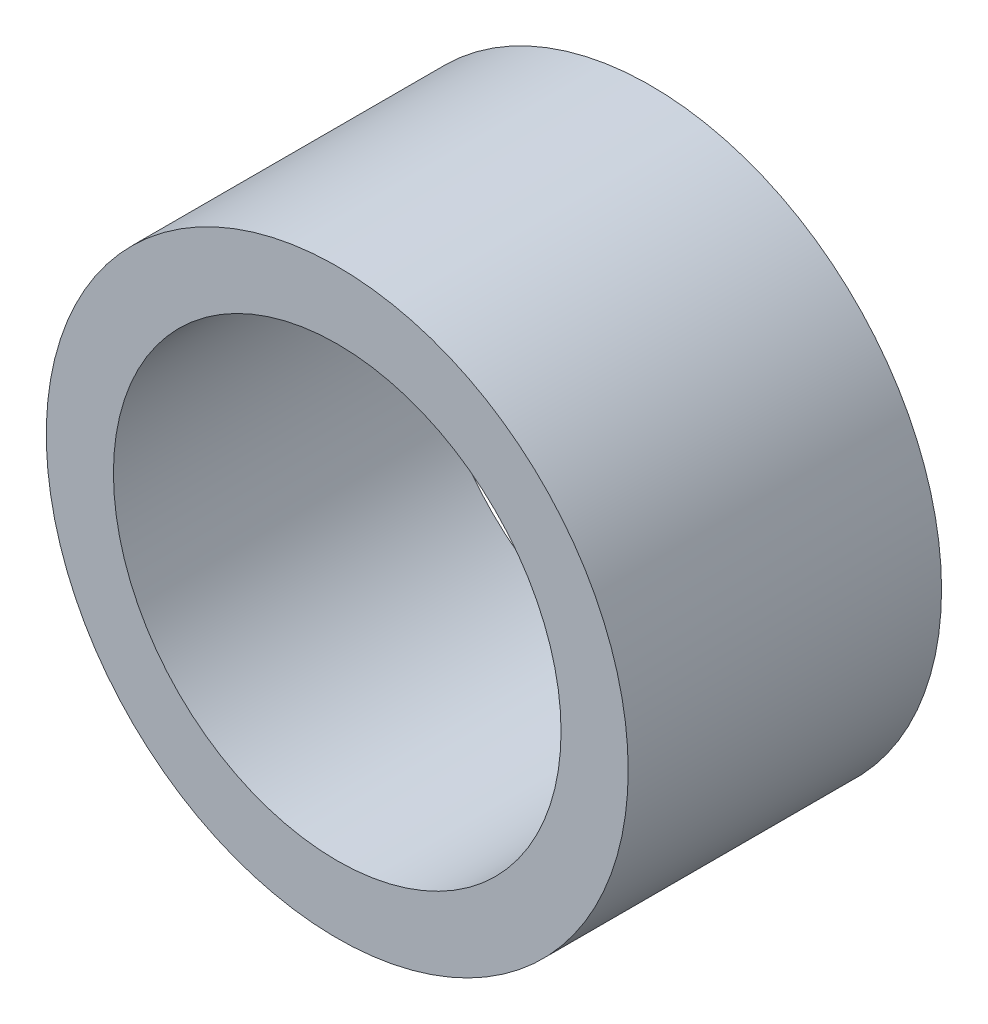
ISO-10303-21;
HEADER;
FILE_DESCRIPTION(('STEP AP214'),'2;1');
FILE_NAME('part.step','',(''),(''),'','','');
FILE_SCHEMA(('AUTOMOTIVE_DESIGN { 1 0 10303 214 1 1 1 1 }'));
ENDSEC;
DATA;
#1=APPLICATION_CONTEXT('core data for automotive mechanical design processes');
#2=APPLICATION_PROTOCOL_DEFINITION('international standard','automotive_design',2000,#1);
#3=PRODUCT_CONTEXT('',#1,'mechanical');
#4=PRODUCT('Part','Part','',(#3));
#5=PRODUCT_RELATED_PRODUCT_CATEGORY('part','',(#4));
#6=PRODUCT_DEFINITION_FORMATION('','',#4);
#7=PRODUCT_DEFINITION_CONTEXT('part definition',#1,'design');
#8=PRODUCT_DEFINITION('design','',#6,#7);
#9=PRODUCT_DEFINITION_SHAPE('','',#8);
#10=(LENGTH_UNIT() NAMED_UNIT(*) SI_UNIT(.MILLI.,.METRE.));
#11=(NAMED_UNIT(*) PLANE_ANGLE_UNIT() SI_UNIT($,.RADIAN.));
#12=(NAMED_UNIT(*) SI_UNIT($,.STERADIAN.) SOLID_ANGLE_UNIT());
#13=UNCERTAINTY_MEASURE_WITH_UNIT(LENGTH_MEASURE(1.E-05),#10,'distance_accuracy_value','');
#14=(GEOMETRIC_REPRESENTATION_CONTEXT(3) GLOBAL_UNCERTAINTY_ASSIGNED_CONTEXT((#13)) GLOBAL_UNIT_ASSIGNED_CONTEXT((#10,
#11,#12)) REPRESENTATION_CONTEXT('',''));
#15=CARTESIAN_POINT('',(0.,0.,0.));
#16=DIRECTION('',(0.,0.,1.));
#17=DIRECTION('',(1.,0.,0.));
#18=AXIS2_PLACEMENT_3D('',#15,#16,#17);
#19=CARTESIAN_POINT('',(0.,0.,7.));
#20=DIRECTION('',(0.,0.,1.));
#21=DIRECTION('',(1.,0.,0.));
#22=AXIS2_PLACEMENT_3D('',#19,#20,#21);
#23=PLANE('',#22);
#24=CARTESIAN_POINT('',(0.,0.,7.));
#25=DIRECTION('',(0.,0.,1.));
#26=DIRECTION('',(1.,0.,0.));
#27=AXIS2_PLACEMENT_3D('',#24,#25,#26);
#28=CIRCLE('',#27,6.5);
#29=CARTESIAN_POINT('',(6.5,0.,7.));
#30=VERTEX_POINT('',#29);
#31=EDGE_CURVE('E10',#30,#30,#28,.T.);
#32=ORIENTED_EDGE('',*,*,#31,.T.);
#33=EDGE_LOOP('',(#32));
#34=FACE_BOUND('',#33,.T.);
#35=CARTESIAN_POINT('',(0.,0.,7.));
#36=DIRECTION('',(0.,0.,1.));
#37=DIRECTION('',(1.,0.,0.));
#38=AXIS2_PLACEMENT_3D('',#35,#36,#37);
#39=CIRCLE('',#38,5.);
#40=CARTESIAN_POINT('',(5.,0.,7.));
#41=VERTEX_POINT('',#40);
#42=EDGE_CURVE('E50',#41,#41,#39,.T.);
#43=ORIENTED_EDGE('',*,*,#42,.F.);
#44=EDGE_LOOP('',(#43));
#45=FACE_BOUND('',#44,.T.);
#46=ADVANCED_FACE('F37',(#34,#45),#23,.T.);
#47=CARTESIAN_POINT('',(0.,0.,0.));
#48=DIRECTION('',(0.,0.,1.));
#49=DIRECTION('',(1.,0.,0.));
#50=AXIS2_PLACEMENT_3D('',#47,#48,#49);
#51=PLANE('',#50);
#52=CARTESIAN_POINT('',(0.,0.,0.));
#53=DIRECTION('',(0.,0.,1.));
#54=DIRECTION('',(1.,0.,0.));
#55=AXIS2_PLACEMENT_3D('',#52,#53,#54);
#56=CIRCLE('',#55,6.5);
#57=CARTESIAN_POINT('',(6.5,0.,0.));
#58=VERTEX_POINT('',#57);
#59=EDGE_CURVE('E41',#58,#58,#56,.T.);
#60=ORIENTED_EDGE('',*,*,#59,.F.);
#61=EDGE_LOOP('',(#60));
#62=FACE_BOUND('',#61,.T.);
#63=CARTESIAN_POINT('',(0.,0.,0.));
#64=DIRECTION('',(0.,0.,1.));
#65=DIRECTION('',(1.,0.,0.));
#66=AXIS2_PLACEMENT_3D('',#63,#64,#65);
#67=CIRCLE('',#66,5.);
#68=CARTESIAN_POINT('',(5.,0.,0.));
#69=VERTEX_POINT('',#68);
#70=EDGE_CURVE('E52',#69,#69,#67,.T.);
#71=ORIENTED_EDGE('',*,*,#70,.T.);
#72=EDGE_LOOP('',(#71));
#73=FACE_BOUND('',#72,.T.);
#74=ADVANCED_FACE('F64',(#62,#73),#51,.F.);
#75=CARTESIAN_POINT('',(0.,0.,7.));
#76=DIRECTION('',(0.,0.,-1.));
#77=DIRECTION('',(-1.,0.,0.));
#78=AXIS2_PLACEMENT_3D('',#75,#76,#77);
#79=CYLINDRICAL_SURFACE('',#78,6.5);
#80=ORIENTED_EDGE('',*,*,#31,.F.);
#81=EDGE_LOOP('',(#80));
#82=FACE_BOUND('',#81,.T.);
#83=ORIENTED_EDGE('',*,*,#59,.T.);
#84=EDGE_LOOP('',(#83));
#85=FACE_BOUND('',#84,.T.);
#86=ADVANCED_FACE('F39',(#82,#85),#79,.T.);
#87=CARTESIAN_POINT('',(0.,0.,7.));
#88=DIRECTION('',(0.,0.,-1.));
#89=DIRECTION('',(-1.,0.,0.));
#90=AXIS2_PLACEMENT_3D('',#87,#88,#89);
#91=CYLINDRICAL_SURFACE('',#90,5.);
#92=ORIENTED_EDGE('',*,*,#42,.T.);
#93=EDGE_LOOP('',(#92));
#94=FACE_BOUND('',#93,.T.);
#95=ORIENTED_EDGE('',*,*,#70,.F.);
#96=EDGE_LOOP('',(#95));
#97=FACE_BOUND('',#96,.T.);
#98=ADVANCED_FACE('F60',(#94,#97),#91,.F.);
#99=CLOSED_SHELL('',(#46,#74,#86,#98));
#100=MANIFOLD_SOLID_BREP('B2',#99);
#101=ADVANCED_BREP_SHAPE_REPRESENTATION('',(#18,#100),#14);
#102=SHAPE_DEFINITION_REPRESENTATION(#9,#101);
ENDSEC;
END-ISO-10303-21;
